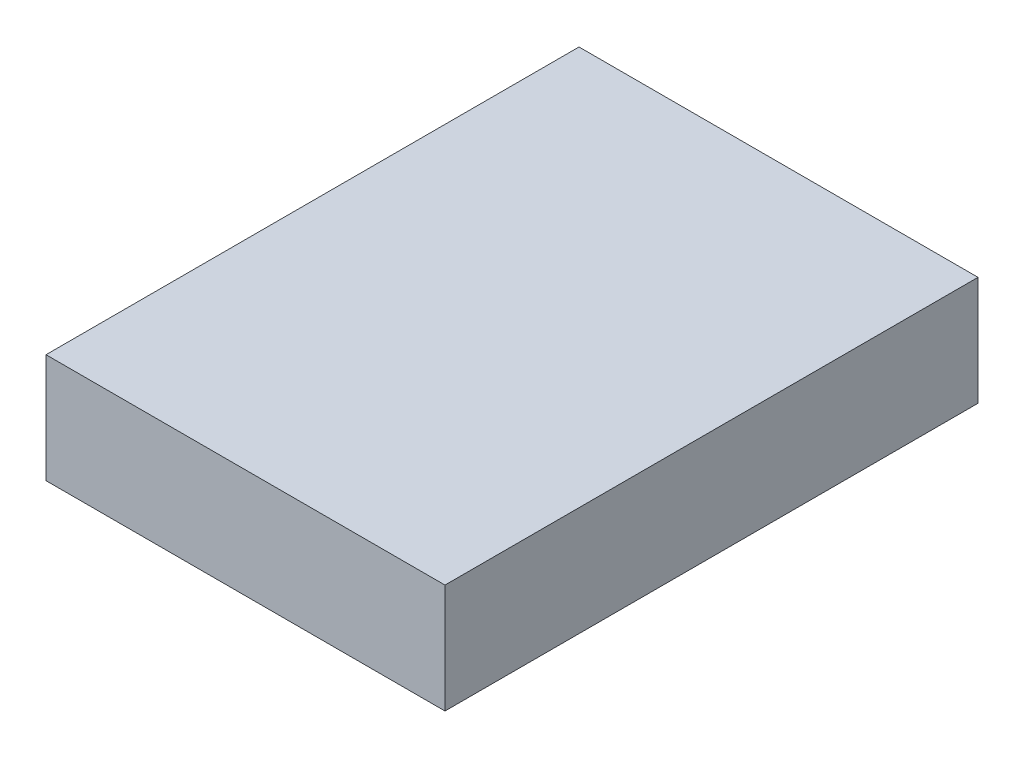
ISO-10303-21;
HEADER;
FILE_DESCRIPTION(('STEP AP214'),'2;1');
FILE_NAME('part.step','',(''),(''),'','','');
FILE_SCHEMA(('AUTOMOTIVE_DESIGN { 1 0 10303 214 1 1 1 1 }'));
ENDSEC;
DATA;
#1=APPLICATION_CONTEXT('core data for automotive mechanical design processes');
#2=APPLICATION_PROTOCOL_DEFINITION('international standard','automotive_design',2000,#1);
#3=PRODUCT_CONTEXT('',#1,'mechanical');
#4=PRODUCT('Part','Part','',(#3));
#5=PRODUCT_RELATED_PRODUCT_CATEGORY('part','',(#4));
#6=PRODUCT_DEFINITION_FORMATION('','',#4);
#7=PRODUCT_DEFINITION_CONTEXT('part definition',#1,'design');
#8=PRODUCT_DEFINITION('design','',#6,#7);
#9=PRODUCT_DEFINITION_SHAPE('','',#8);
#10=(LENGTH_UNIT() NAMED_UNIT(*) SI_UNIT(.MILLI.,.METRE.));
#11=(NAMED_UNIT(*) PLANE_ANGLE_UNIT() SI_UNIT($,.RADIAN.));
#12=(NAMED_UNIT(*) SI_UNIT($,.STERADIAN.) SOLID_ANGLE_UNIT());
#13=UNCERTAINTY_MEASURE_WITH_UNIT(LENGTH_MEASURE(1.E-05),#10,'distance_accuracy_value','');
#14=(GEOMETRIC_REPRESENTATION_CONTEXT(3) GLOBAL_UNCERTAINTY_ASSIGNED_CONTEXT((#13)) GLOBAL_UNIT_ASSIGNED_CONTEXT((#10,
#11,#12)) REPRESENTATION_CONTEXT('',''));
#15=CARTESIAN_POINT('',(0.,0.,0.));
#16=DIRECTION('',(0.,0.,1.));
#17=DIRECTION('',(1.,0.,0.));
#18=AXIS2_PLACEMENT_3D('',#15,#16,#17);
#19=CARTESIAN_POINT('',(-12.8,7.,17.1));
#20=DIRECTION('',(1.,0.,0.));
#21=DIRECTION('',(0.,0.,-1.));
#22=AXIS2_PLACEMENT_3D('',#19,#20,#21);
#23=PLANE('',#22);
#24=DIRECTION('',(0.,0.,1.));
#25=VECTOR('',#24,1.);
#26=CARTESIAN_POINT('',(-12.8,0.,17.1));
#27=LINE('',#26,#25);
#28=CARTESIAN_POINT('',(-12.8,0.,-17.1));
#29=VERTEX_POINT('',#28);
#30=CARTESIAN_POINT('',(-12.8,0.,17.1));
#31=VERTEX_POINT('',#30);
#32=EDGE_CURVE('E96',#29,#31,#27,.T.);
#33=ORIENTED_EDGE('',*,*,#32,.T.);
#34=DIRECTION('',(0.,-1.,0.));
#35=VECTOR('',#34,1.);
#36=CARTESIAN_POINT('',(-12.8,7.,17.1));
#37=LINE('',#36,#35);
#38=CARTESIAN_POINT('',(-12.8,7.,17.1));
#39=VERTEX_POINT('',#38);
#40=EDGE_CURVE('E11',#39,#31,#37,.T.);
#41=ORIENTED_EDGE('',*,*,#40,.F.);
#42=DIRECTION('',(0.,0.,1.));
#43=VECTOR('',#42,1.);
#44=CARTESIAN_POINT('',(-12.8,7.,17.1));
#45=LINE('',#44,#43);
#46=CARTESIAN_POINT('',(-12.8,7.,-17.1));
#47=VERTEX_POINT('',#46);
#48=EDGE_CURVE('E84',#47,#39,#45,.T.);
#49=ORIENTED_EDGE('',*,*,#48,.F.);
#50=DIRECTION('',(0.,-1.,0.));
#51=VECTOR('',#50,1.);
#52=CARTESIAN_POINT('',(-12.8,7.,-17.1));
#53=LINE('',#52,#51);
#54=EDGE_CURVE('E92',#47,#29,#53,.T.);
#55=ORIENTED_EDGE('',*,*,#54,.T.);
#56=EDGE_LOOP('',(#33,#41,#49,#55));
#57=FACE_BOUND('',#56,.T.);
#58=ADVANCED_FACE('F33',(#57),#23,.F.);
#59=CARTESIAN_POINT('',(12.8,7.,17.1));
#60=DIRECTION('',(0.,0.,-1.));
#61=DIRECTION('',(-1.,0.,0.));
#62=AXIS2_PLACEMENT_3D('',#59,#60,#61);
#63=PLANE('',#62);
#64=DIRECTION('',(1.,0.,0.));
#65=VECTOR('',#64,1.);
#66=CARTESIAN_POINT('',(12.8,0.,17.1));
#67=LINE('',#66,#65);
#68=CARTESIAN_POINT('',(12.8,0.,17.1));
#69=VERTEX_POINT('',#68);
#70=EDGE_CURVE('E88',#31,#69,#67,.T.);
#71=ORIENTED_EDGE('',*,*,#70,.T.);
#72=DIRECTION('',(0.,-1.,0.));
#73=VECTOR('',#72,1.);
#74=CARTESIAN_POINT('',(12.8,7.,17.1));
#75=LINE('',#74,#73);
#76=CARTESIAN_POINT('',(12.8,7.,17.1));
#77=VERTEX_POINT('',#76);
#78=EDGE_CURVE('E41',#77,#69,#75,.T.);
#79=ORIENTED_EDGE('',*,*,#78,.F.);
#80=DIRECTION('',(1.,0.,0.));
#81=VECTOR('',#80,1.);
#82=CARTESIAN_POINT('',(12.8,7.,17.1));
#83=LINE('',#82,#81);
#84=EDGE_CURVE('E79',#39,#77,#83,.T.);
#85=ORIENTED_EDGE('',*,*,#84,.F.);
#86=ORIENTED_EDGE('',*,*,#40,.T.);
#87=EDGE_LOOP('',(#71,#79,#85,#86));
#88=FACE_BOUND('',#87,.T.);
#89=ADVANCED_FACE('F87',(#88),#63,.F.);
#90=CARTESIAN_POINT('',(12.8,7.,17.1));
#91=DIRECTION('',(-1.,0.,0.));
#92=DIRECTION('',(0.,0.,1.));
#93=AXIS2_PLACEMENT_3D('',#90,#91,#92);
#94=PLANE('',#93);
#95=DIRECTION('',(0.,0.,-1.));
#96=VECTOR('',#95,1.);
#97=CARTESIAN_POINT('',(12.8,0.,17.1));
#98=LINE('',#97,#96);
#99=CARTESIAN_POINT('',(12.8,0.,-17.1));
#100=VERTEX_POINT('',#99);
#101=EDGE_CURVE('E66',#69,#100,#98,.T.);
#102=ORIENTED_EDGE('',*,*,#101,.T.);
#103=DIRECTION('',(0.,-1.,0.));
#104=VECTOR('',#103,1.);
#105=CARTESIAN_POINT('',(12.8,7.,-17.1));
#106=LINE('',#105,#104);
#107=CARTESIAN_POINT('',(12.8,7.,-17.1));
#108=VERTEX_POINT('',#107);
#109=EDGE_CURVE('E89',#108,#100,#106,.T.);
#110=ORIENTED_EDGE('',*,*,#109,.F.);
#111=DIRECTION('',(0.,0.,-1.));
#112=VECTOR('',#111,1.);
#113=CARTESIAN_POINT('',(12.8,7.,17.1));
#114=LINE('',#113,#112);
#115=EDGE_CURVE('E82',#77,#108,#114,.T.);
#116=ORIENTED_EDGE('',*,*,#115,.F.);
#117=ORIENTED_EDGE('',*,*,#78,.T.);
#118=EDGE_LOOP('',(#102,#110,#116,#117));
#119=FACE_BOUND('',#118,.T.);
#120=ADVANCED_FACE('F90',(#119),#94,.F.);
#121=CARTESIAN_POINT('',(12.8,7.,-17.1));
#122=DIRECTION('',(0.,0.,1.));
#123=DIRECTION('',(1.,0.,0.));
#124=AXIS2_PLACEMENT_3D('',#121,#122,#123);
#125=PLANE('',#124);
#126=DIRECTION('',(-1.,0.,0.));
#127=VECTOR('',#126,1.);
#128=CARTESIAN_POINT('',(12.8,0.,-17.1));
#129=LINE('',#128,#127);
#130=EDGE_CURVE('E72',#100,#29,#129,.T.);
#131=ORIENTED_EDGE('',*,*,#130,.T.);
#132=ORIENTED_EDGE('',*,*,#54,.F.);
#133=DIRECTION('',(-1.,0.,0.));
#134=VECTOR('',#133,1.);
#135=CARTESIAN_POINT('',(12.8,7.,-17.1));
#136=LINE('',#135,#134);
#137=EDGE_CURVE('E49',#108,#47,#136,.T.);
#138=ORIENTED_EDGE('',*,*,#137,.F.);
#139=ORIENTED_EDGE('',*,*,#109,.T.);
#140=EDGE_LOOP('',(#131,#132,#138,#139));
#141=FACE_BOUND('',#140,.T.);
#142=ADVANCED_FACE('F103',(#141),#125,.F.);
#143=CARTESIAN_POINT('',(0.,7.,0.));
#144=DIRECTION('',(0.,1.,0.));
#145=DIRECTION('',(0.,0.,1.));
#146=AXIS2_PLACEMENT_3D('',#143,#144,#145);
#147=PLANE('',#146);
#148=ORIENTED_EDGE('',*,*,#48,.T.);
#149=ORIENTED_EDGE('',*,*,#84,.T.);
#150=ORIENTED_EDGE('',*,*,#115,.T.);
#151=ORIENTED_EDGE('',*,*,#137,.T.);
#152=EDGE_LOOP('',(#148,#149,#150,#151));
#153=FACE_BOUND('',#152,.T.);
#154=ADVANCED_FACE('F80',(#153),#147,.T.);
#155=CARTESIAN_POINT('',(0.,0.,0.));
#156=DIRECTION('',(0.,1.,0.));
#157=DIRECTION('',(0.,0.,1.));
#158=AXIS2_PLACEMENT_3D('',#155,#156,#157);
#159=PLANE('',#158);
#160=ORIENTED_EDGE('',*,*,#32,.F.);
#161=ORIENTED_EDGE('',*,*,#130,.F.);
#162=ORIENTED_EDGE('',*,*,#101,.F.);
#163=ORIENTED_EDGE('',*,*,#70,.F.);
#164=EDGE_LOOP('',(#160,#161,#162,#163));
#165=FACE_BOUND('',#164,.T.);
#166=ADVANCED_FACE('F106',(#165),#159,.F.);
#167=CLOSED_SHELL('',(#58,#89,#120,#142,#154,#166));
#168=MANIFOLD_SOLID_BREP('B2',#167);
#169=ADVANCED_BREP_SHAPE_REPRESENTATION('',(#18,#168),#14);
#170=SHAPE_DEFINITION_REPRESENTATION(#9,#169);
ENDSEC;
END-ISO-10303-21;
